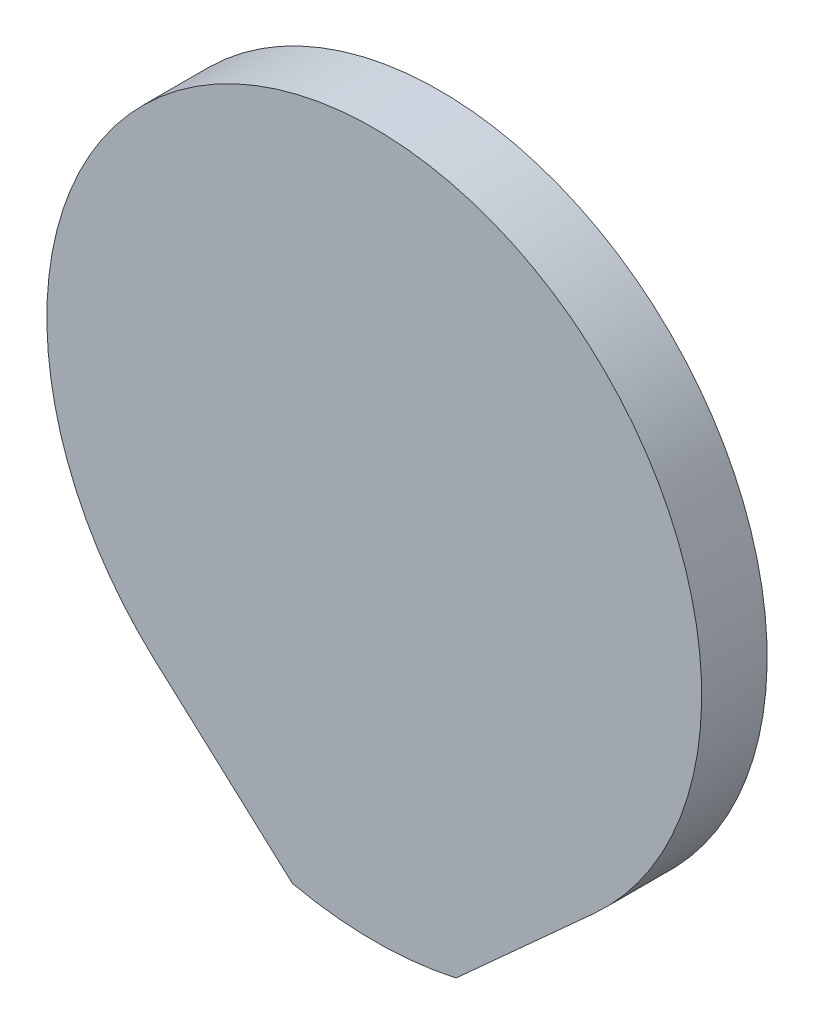
ISO-10303-21;
HEADER;
FILE_DESCRIPTION(('STEP AP214'),'2;1');
FILE_NAME('part.step','',(''),(''),'','','');
FILE_SCHEMA(('AUTOMOTIVE_DESIGN { 1 0 10303 214 1 1 1 1 }'));
ENDSEC;
DATA;
#1=APPLICATION_CONTEXT('core data for automotive mechanical design processes');
#2=APPLICATION_PROTOCOL_DEFINITION('international standard','automotive_design',2000,#1);
#3=PRODUCT_CONTEXT('',#1,'mechanical');
#4=PRODUCT('Part','Part','',(#3));
#5=PRODUCT_RELATED_PRODUCT_CATEGORY('part','',(#4));
#6=PRODUCT_DEFINITION_FORMATION('','',#4);
#7=PRODUCT_DEFINITION_CONTEXT('part definition',#1,'design');
#8=PRODUCT_DEFINITION('design','',#6,#7);
#9=PRODUCT_DEFINITION_SHAPE('','',#8);
#10=(LENGTH_UNIT() NAMED_UNIT(*) SI_UNIT(.MILLI.,.METRE.));
#11=(NAMED_UNIT(*) PLANE_ANGLE_UNIT() SI_UNIT($,.RADIAN.));
#12=(NAMED_UNIT(*) SI_UNIT($,.STERADIAN.) SOLID_ANGLE_UNIT());
#13=UNCERTAINTY_MEASURE_WITH_UNIT(LENGTH_MEASURE(1.E-05),#10,'distance_accuracy_value','');
#14=(GEOMETRIC_REPRESENTATION_CONTEXT(3) GLOBAL_UNCERTAINTY_ASSIGNED_CONTEXT((#13)) GLOBAL_UNIT_ASSIGNED_CONTEXT((#10,
#11,#12)) REPRESENTATION_CONTEXT('',''));
#15=CARTESIAN_POINT('',(0.,0.,0.));
#16=DIRECTION('',(0.,0.,1.));
#17=DIRECTION('',(1.,0.,0.));
#18=AXIS2_PLACEMENT_3D('',#15,#16,#17);
#19=CARTESIAN_POINT('',(0.,0.,40.));
#20=DIRECTION('',(0.,0.,-1.));
#21=DIRECTION('',(-1.,0.,0.));
#22=AXIS2_PLACEMENT_3D('',#19,#20,#21);
#23=CYLINDRICAL_SURFACE('',#22,230.);
#24=CARTESIAN_POINT('',(0.,0.,0.));
#25=DIRECTION('',(0.,0.,1.));
#26=DIRECTION('',(1.,0.,0.));
#27=AXIS2_PLACEMENT_3D('',#24,#25,#26);
#28=CIRCLE('',#27,230.);
#29=CARTESIAN_POINT('',(-50.,-224.499443206436,0.));
#30=VERTEX_POINT('',#29);
#31=CARTESIAN_POINT('',(50.,-224.499443206436,0.));
#32=VERTEX_POINT('',#31);
#33=EDGE_CURVE('E122',#30,#32,#28,.T.);
#34=ORIENTED_EDGE('',*,*,#33,.T.);
#35=DIRECTION('',(0.,0.,-1.));
#36=VECTOR('',#35,1.);
#37=CARTESIAN_POINT('',(50.,-224.499443206436,40.));
#38=LINE('',#37,#36);
#39=CARTESIAN_POINT('',(50.,-224.499443206436,40.));
#40=VERTEX_POINT('',#39);
#41=EDGE_CURVE('E13',#40,#32,#38,.T.);
#42=ORIENTED_EDGE('',*,*,#41,.F.);
#43=CARTESIAN_POINT('',(0.,0.,40.));
#44=DIRECTION('',(0.,0.,1.));
#45=DIRECTION('',(1.,0.,0.));
#46=AXIS2_PLACEMENT_3D('',#43,#44,#45);
#47=CIRCLE('',#46,230.);
#48=CARTESIAN_POINT('',(-50.,-224.499443206436,40.));
#49=VERTEX_POINT('',#48);
#50=EDGE_CURVE('E104',#49,#40,#47,.T.);
#51=ORIENTED_EDGE('',*,*,#50,.F.);
#52=DIRECTION('',(0.,0.,-1.));
#53=VECTOR('',#52,1.);
#54=CARTESIAN_POINT('',(-50.,-224.499443206436,40.));
#55=LINE('',#54,#53);
#56=EDGE_CURVE('E71',#49,#30,#55,.T.);
#57=ORIENTED_EDGE('',*,*,#56,.T.);
#58=EDGE_LOOP('',(#34,#42,#51,#57));
#59=FACE_BOUND('',#58,.T.);
#60=ADVANCED_FACE('F54',(#59),#23,.T.);
#61=CARTESIAN_POINT('',(134.208828858416,-148.283479378023,40.));
#62=DIRECTION('',(-0.671044144292078,0.741417396890114,0.));
#63=DIRECTION('',(-0.741417396890114,-0.671044144292078,0.));
#64=AXIS2_PLACEMENT_3D('',#61,#62,#63);
#65=PLANE('',#64);
#66=DIRECTION('',(0.741417396890114,0.671044144292078,0.));
#67=VECTOR('',#66,1.);
#68=CARTESIAN_POINT('',(134.208828858416,-148.283479378023,0.));
#69=LINE('',#68,#67);
#70=CARTESIAN_POINT('',(134.208828858416,-148.283479378023,0.));
#71=VERTEX_POINT('',#70);
#72=EDGE_CURVE('E110',#32,#71,#69,.T.);
#73=ORIENTED_EDGE('',*,*,#72,.T.);
#74=DIRECTION('',(0.,0.,-1.));
#75=VECTOR('',#74,1.);
#76=CARTESIAN_POINT('',(134.208828858416,-148.283479378023,40.));
#77=LINE('',#76,#75);
#78=CARTESIAN_POINT('',(134.208828858416,-148.283479378023,40.));
#79=VERTEX_POINT('',#78);
#80=EDGE_CURVE('E63',#79,#71,#77,.T.);
#81=ORIENTED_EDGE('',*,*,#80,.F.);
#82=DIRECTION('',(0.741417396890114,0.671044144292078,0.));
#83=VECTOR('',#82,1.);
#84=CARTESIAN_POINT('',(134.208828858416,-148.283479378023,40.));
#85=LINE('',#84,#83);
#86=EDGE_CURVE('E97',#40,#79,#85,.T.);
#87=ORIENTED_EDGE('',*,*,#86,.F.);
#88=ORIENTED_EDGE('',*,*,#41,.T.);
#89=EDGE_LOOP('',(#73,#81,#87,#88));
#90=FACE_BOUND('',#89,.T.);
#91=ADVANCED_FACE('F109',(#90),#65,.F.);
#92=CARTESIAN_POINT('',(0.,0.,40.));
#93=DIRECTION('',(0.,0.,-1.));
#94=DIRECTION('',(-1.,0.,0.));
#95=AXIS2_PLACEMENT_3D('',#92,#93,#94);
#96=CYLINDRICAL_SURFACE('',#95,200.);
#97=CARTESIAN_POINT('',(0.,0.,0.));
#98=DIRECTION('',(0.,0.,1.));
#99=DIRECTION('',(1.,0.,0.));
#100=AXIS2_PLACEMENT_3D('',#97,#98,#99);
#101=CIRCLE('',#100,200.);
#102=CARTESIAN_POINT('',(-134.208828858416,-148.283479378023,0.));
#103=VERTEX_POINT('',#102);
#104=EDGE_CURVE('E127',#71,#103,#101,.T.);
#105=ORIENTED_EDGE('',*,*,#104,.T.);
#106=DIRECTION('',(0.,0.,-1.));
#107=VECTOR('',#106,1.);
#108=CARTESIAN_POINT('',(-134.208828858416,-148.283479378023,40.));
#109=LINE('',#108,#107);
#110=CARTESIAN_POINT('',(-134.208828858416,-148.283479378023,40.));
#111=VERTEX_POINT('',#110);
#112=EDGE_CURVE('E86',#111,#103,#109,.T.);
#113=ORIENTED_EDGE('',*,*,#112,.F.);
#114=CARTESIAN_POINT('',(0.,0.,40.));
#115=DIRECTION('',(0.,0.,1.));
#116=DIRECTION('',(1.,0.,0.));
#117=AXIS2_PLACEMENT_3D('',#114,#115,#116);
#118=CIRCLE('',#117,200.);
#119=EDGE_CURVE('E103',#79,#111,#118,.T.);
#120=ORIENTED_EDGE('',*,*,#119,.F.);
#121=ORIENTED_EDGE('',*,*,#80,.T.);
#122=EDGE_LOOP('',(#105,#113,#120,#121));
#123=FACE_BOUND('',#122,.T.);
#124=ADVANCED_FACE('F114',(#123),#96,.T.);
#125=CARTESIAN_POINT('',(-134.208828858416,-148.283479378023,40.));
#126=DIRECTION('',(-0.671044144292078,-0.741417396890114,0.));
#127=DIRECTION('',(0.741417396890114,-0.671044144292078,0.));
#128=AXIS2_PLACEMENT_3D('',#125,#126,#127);
#129=PLANE('',#128);
#130=DIRECTION('',(-0.741417396890114,0.671044144292078,0.));
#131=VECTOR('',#130,1.);
#132=CARTESIAN_POINT('',(-134.208828858416,-148.283479378023,0.));
#133=LINE('',#132,#131);
#134=EDGE_CURVE('E130',#30,#103,#133,.T.);
#135=ORIENTED_EDGE('',*,*,#134,.F.);
#136=ORIENTED_EDGE('',*,*,#56,.F.);
#137=DIRECTION('',(-0.741417396890114,0.671044144292078,0.));
#138=VECTOR('',#137,1.);
#139=CARTESIAN_POINT('',(-134.208828858416,-148.283479378023,40.));
#140=LINE('',#139,#138);
#141=EDGE_CURVE('E116',#49,#111,#140,.T.);
#142=ORIENTED_EDGE('',*,*,#141,.T.);
#143=ORIENTED_EDGE('',*,*,#112,.T.);
#144=EDGE_LOOP('',(#135,#136,#142,#143));
#145=FACE_BOUND('',#144,.T.);
#146=ADVANCED_FACE('F140',(#145),#129,.T.);
#147=CARTESIAN_POINT('',(0.,0.,40.));
#148=DIRECTION('',(0.,0.,1.));
#149=DIRECTION('',(1.,0.,0.));
#150=AXIS2_PLACEMENT_3D('',#147,#148,#149);
#151=PLANE('',#150);
#152=ORIENTED_EDGE('',*,*,#50,.T.);
#153=ORIENTED_EDGE('',*,*,#86,.T.);
#154=ORIENTED_EDGE('',*,*,#119,.T.);
#155=ORIENTED_EDGE('',*,*,#141,.F.);
#156=EDGE_LOOP('',(#152,#153,#154,#155));
#157=FACE_BOUND('',#156,.T.);
#158=ADVANCED_FACE('F100',(#157),#151,.T.);
#159=CARTESIAN_POINT('',(0.,0.,0.));
#160=DIRECTION('',(0.,0.,1.));
#161=DIRECTION('',(1.,0.,0.));
#162=AXIS2_PLACEMENT_3D('',#159,#160,#161);
#163=PLANE('',#162);
#164=ORIENTED_EDGE('',*,*,#33,.F.);
#165=ORIENTED_EDGE('',*,*,#134,.T.);
#166=ORIENTED_EDGE('',*,*,#104,.F.);
#167=ORIENTED_EDGE('',*,*,#72,.F.);
#168=EDGE_LOOP('',(#164,#165,#166,#167));
#169=FACE_BOUND('',#168,.T.);
#170=ADVANCED_FACE('F139',(#169),#163,.F.);
#171=CLOSED_SHELL('',(#60,#91,#124,#146,#158,#170));
#172=MANIFOLD_SOLID_BREP('B2',#171);
#173=ADVANCED_BREP_SHAPE_REPRESENTATION('',(#18,#172),#14);
#174=SHAPE_DEFINITION_REPRESENTATION(#9,#173);
ENDSEC;
END-ISO-10303-21;
